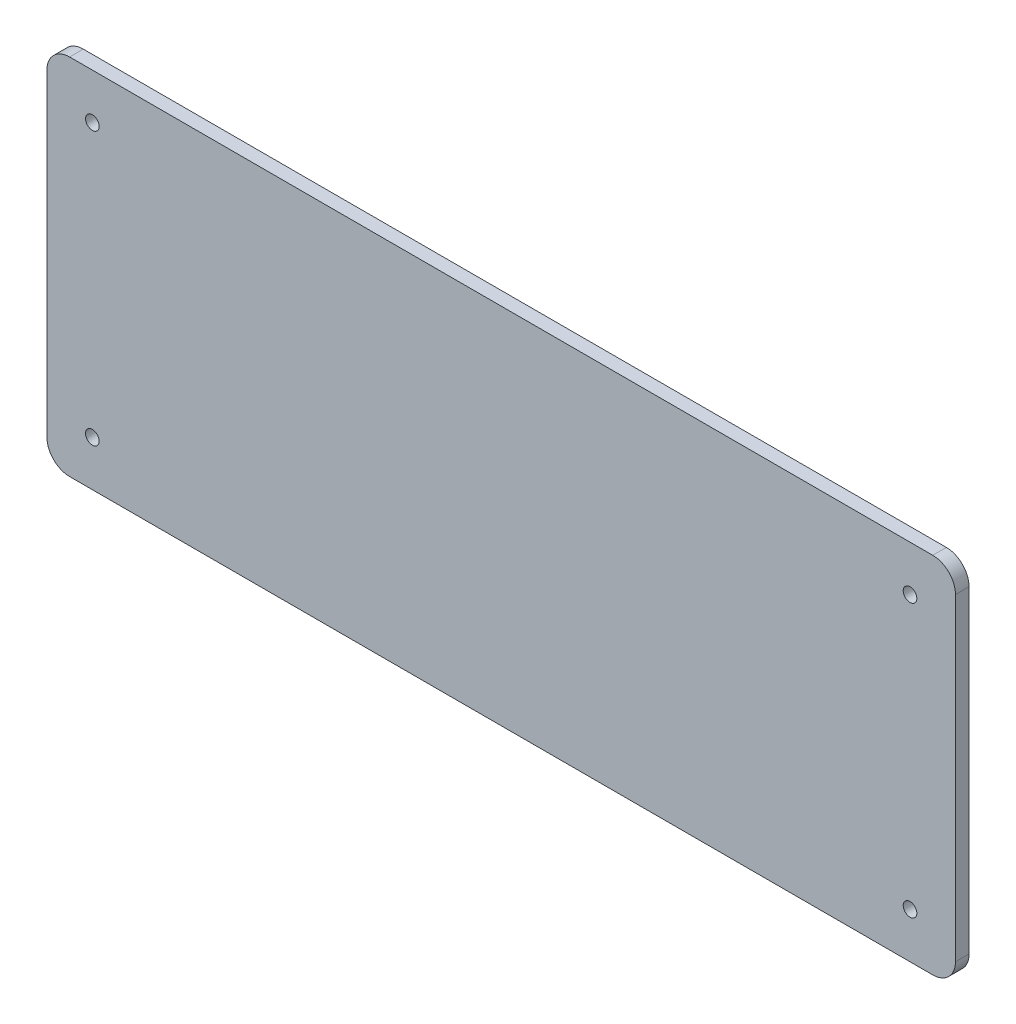
ISO-10303-21;
HEADER;
FILE_DESCRIPTION(('STEP AP214'),'2;1');
FILE_NAME('part.step','',(''),(''),'','','');
FILE_SCHEMA(('AUTOMOTIVE_DESIGN { 1 0 10303 214 1 1 1 1 }'));
ENDSEC;
DATA;
#1=APPLICATION_CONTEXT('core data for automotive mechanical design processes');
#2=APPLICATION_PROTOCOL_DEFINITION('international standard','automotive_design',2000,#1);
#3=PRODUCT_CONTEXT('',#1,'mechanical');
#4=PRODUCT('Part','Part','',(#3));
#5=PRODUCT_RELATED_PRODUCT_CATEGORY('part','',(#4));
#6=PRODUCT_DEFINITION_FORMATION('','',#4);
#7=PRODUCT_DEFINITION_CONTEXT('part definition',#1,'design');
#8=PRODUCT_DEFINITION('design','',#6,#7);
#9=PRODUCT_DEFINITION_SHAPE('','',#8);
#10=(LENGTH_UNIT() NAMED_UNIT(*) SI_UNIT(.MILLI.,.METRE.));
#11=(NAMED_UNIT(*) PLANE_ANGLE_UNIT() SI_UNIT($,.RADIAN.));
#12=(NAMED_UNIT(*) SI_UNIT($,.STERADIAN.) SOLID_ANGLE_UNIT());
#13=UNCERTAINTY_MEASURE_WITH_UNIT(LENGTH_MEASURE(1.E-05),#10,'distance_accuracy_value','');
#14=(GEOMETRIC_REPRESENTATION_CONTEXT(3) GLOBAL_UNCERTAINTY_ASSIGNED_CONTEXT((#13)) GLOBAL_UNIT_ASSIGNED_CONTEXT((#10,
#11,#12)) REPRESENTATION_CONTEXT('',''));
#15=CARTESIAN_POINT('',(0.,0.,0.));
#16=DIRECTION('',(0.,0.,1.));
#17=DIRECTION('',(1.,0.,0.));
#18=AXIS2_PLACEMENT_3D('',#15,#16,#17);
#19=CARTESIAN_POINT('',(95.,35.,3.));
#20=DIRECTION('',(0.,0.,1.));
#21=DIRECTION('',(1.,0.,0.));
#22=AXIS2_PLACEMENT_3D('',#19,#20,#21);
#23=PLANE('',#22);
#24=CARTESIAN_POINT('',(90.0000000000006,-30.,3.));
#25=DIRECTION('',(0.,0.,1.));
#26=DIRECTION('',(1.,0.,0.));
#27=AXIS2_PLACEMENT_3D('',#24,#25,#26);
#28=CIRCLE('',#27,1.5);
#29=CARTESIAN_POINT('',(91.5000000000006,-30.,3.));
#30=VERTEX_POINT('',#29);
#31=EDGE_CURVE('E191',#30,#30,#28,.T.);
#32=ORIENTED_EDGE('',*,*,#31,.F.);
#33=EDGE_LOOP('',(#32));
#34=FACE_BOUND('',#33,.T.);
#35=CARTESIAN_POINT('',(-90.,30.,3.));
#36=DIRECTION('',(0.,0.,1.));
#37=DIRECTION('',(1.,0.,0.));
#38=AXIS2_PLACEMENT_3D('',#35,#36,#37);
#39=CIRCLE('',#38,1.5);
#40=CARTESIAN_POINT('',(-88.5,30.,3.));
#41=VERTEX_POINT('',#40);
#42=EDGE_CURVE('E137',#41,#41,#39,.T.);
#43=ORIENTED_EDGE('',*,*,#42,.F.);
#44=EDGE_LOOP('',(#43));
#45=FACE_BOUND('',#44,.T.);
#46=CARTESIAN_POINT('',(95.,35.,3.));
#47=DIRECTION('',(0.,0.,1.));
#48=DIRECTION('',(1.,0.,0.));
#49=AXIS2_PLACEMENT_3D('',#46,#47,#48);
#50=CIRCLE('',#49,5.);
#51=CARTESIAN_POINT('',(100.,35.,3.));
#52=VERTEX_POINT('',#51);
#53=CARTESIAN_POINT('',(95.,40.,3.));
#54=VERTEX_POINT('',#53);
#55=EDGE_CURVE('E148',#52,#54,#50,.T.);
#56=ORIENTED_EDGE('',*,*,#55,.T.);
#57=DIRECTION('',(-1.,0.,0.));
#58=VECTOR('',#57,1.);
#59=CARTESIAN_POINT('',(95.,40.,3.));
#60=LINE('',#59,#58);
#61=CARTESIAN_POINT('',(-95.,40.,3.));
#62=VERTEX_POINT('',#61);
#63=EDGE_CURVE('E96',#54,#62,#60,.T.);
#64=ORIENTED_EDGE('',*,*,#63,.T.);
#65=CARTESIAN_POINT('',(-95.,35.,3.));
#66=DIRECTION('',(0.,0.,1.));
#67=DIRECTION('',(1.,0.,0.));
#68=AXIS2_PLACEMENT_3D('',#65,#66,#67);
#69=CIRCLE('',#68,5.);
#70=CARTESIAN_POINT('',(-100.,35.,3.));
#71=VERTEX_POINT('',#70);
#72=EDGE_CURVE('E163',#62,#71,#69,.T.);
#73=ORIENTED_EDGE('',*,*,#72,.T.);
#74=DIRECTION('',(0.,-1.,0.));
#75=VECTOR('',#74,1.);
#76=CARTESIAN_POINT('',(-100.,-35.,3.));
#77=LINE('',#76,#75);
#78=CARTESIAN_POINT('',(-100.,-35.,3.));
#79=VERTEX_POINT('',#78);
#80=EDGE_CURVE('E176',#71,#79,#77,.T.);
#81=ORIENTED_EDGE('',*,*,#80,.T.);
#82=CARTESIAN_POINT('',(-95.,-35.,3.));
#83=DIRECTION('',(0.,0.,1.));
#84=DIRECTION('',(-1.,0.,0.));
#85=AXIS2_PLACEMENT_3D('',#82,#83,#84);
#86=CIRCLE('',#85,5.);
#87=CARTESIAN_POINT('',(-95.,-40.,3.));
#88=VERTEX_POINT('',#87);
#89=EDGE_CURVE('E115',#79,#88,#86,.T.);
#90=ORIENTED_EDGE('',*,*,#89,.T.);
#91=DIRECTION('',(1.,0.,0.));
#92=VECTOR('',#91,1.);
#93=CARTESIAN_POINT('',(95.,-40.,3.));
#94=LINE('',#93,#92);
#95=CARTESIAN_POINT('',(95.,-40.,3.));
#96=VERTEX_POINT('',#95);
#97=EDGE_CURVE('E109',#88,#96,#94,.T.);
#98=ORIENTED_EDGE('',*,*,#97,.T.);
#99=CARTESIAN_POINT('',(95.,-35.,3.));
#100=DIRECTION('',(0.,0.,1.));
#101=DIRECTION('',(1.,0.,0.));
#102=AXIS2_PLACEMENT_3D('',#99,#100,#101);
#103=CIRCLE('',#102,5.);
#104=CARTESIAN_POINT('',(100.,-35.,3.));
#105=VERTEX_POINT('',#104);
#106=EDGE_CURVE('E113',#96,#105,#103,.T.);
#107=ORIENTED_EDGE('',*,*,#106,.T.);
#108=DIRECTION('',(0.,1.,0.));
#109=VECTOR('',#108,1.);
#110=CARTESIAN_POINT('',(100.,-35.,3.));
#111=LINE('',#110,#109);
#112=EDGE_CURVE('E53',#105,#52,#111,.T.);
#113=ORIENTED_EDGE('',*,*,#112,.T.);
#114=EDGE_LOOP('',(#56,#64,#73,#81,#90,#98,#107,#113));
#115=FACE_BOUND('',#114,.T.);
#116=CARTESIAN_POINT('',(90.,30.,3.));
#117=DIRECTION('',(0.,0.,1.));
#118=DIRECTION('',(1.,0.,0.));
#119=AXIS2_PLACEMENT_3D('',#116,#117,#118);
#120=CIRCLE('',#119,1.5);
#121=CARTESIAN_POINT('',(91.5,30.,3.));
#122=VERTEX_POINT('',#121);
#123=EDGE_CURVE('E185',#122,#122,#120,.T.);
#124=ORIENTED_EDGE('',*,*,#123,.F.);
#125=EDGE_LOOP('',(#124));
#126=FACE_BOUND('',#125,.T.);
#127=CARTESIAN_POINT('',(-89.9999999999994,-30.,3.));
#128=DIRECTION('',(0.,0.,1.));
#129=DIRECTION('',(1.,0.,0.));
#130=AXIS2_PLACEMENT_3D('',#127,#128,#129);
#131=CIRCLE('',#130,1.5);
#132=CARTESIAN_POINT('',(-88.4999999999994,-30.,3.));
#133=VERTEX_POINT('',#132);
#134=EDGE_CURVE('E197',#133,#133,#131,.T.);
#135=ORIENTED_EDGE('',*,*,#134,.F.);
#136=EDGE_LOOP('',(#135));
#137=FACE_BOUND('',#136,.T.);
#138=ADVANCED_FACE('F36',(#34,#45,#115,#126,#137),#23,.T.);
#139=CARTESIAN_POINT('',(95.,35.,0.));
#140=DIRECTION('',(0.,0.,1.));
#141=DIRECTION('',(1.,0.,0.));
#142=AXIS2_PLACEMENT_3D('',#139,#140,#141);
#143=PLANE('',#142);
#144=CARTESIAN_POINT('',(95.,35.,0.));
#145=DIRECTION('',(0.,0.,1.));
#146=DIRECTION('',(1.,0.,0.));
#147=AXIS2_PLACEMENT_3D('',#144,#145,#146);
#148=CIRCLE('',#147,5.);
#149=CARTESIAN_POINT('',(100.,35.,0.));
#150=VERTEX_POINT('',#149);
#151=CARTESIAN_POINT('',(95.,40.,0.));
#152=VERTEX_POINT('',#151);
#153=EDGE_CURVE('E133',#150,#152,#148,.T.);
#154=ORIENTED_EDGE('',*,*,#153,.F.);
#155=DIRECTION('',(0.,1.,0.));
#156=VECTOR('',#155,1.);
#157=CARTESIAN_POINT('',(100.,-35.,0.));
#158=LINE('',#157,#156);
#159=CARTESIAN_POINT('',(100.,-35.,0.));
#160=VERTEX_POINT('',#159);
#161=EDGE_CURVE('E88',#160,#150,#158,.T.);
#162=ORIENTED_EDGE('',*,*,#161,.F.);
#163=CARTESIAN_POINT('',(95.,-35.,0.));
#164=DIRECTION('',(0.,0.,1.));
#165=DIRECTION('',(1.,0.,0.));
#166=AXIS2_PLACEMENT_3D('',#163,#164,#165);
#167=CIRCLE('',#166,5.);
#168=CARTESIAN_POINT('',(95.,-40.,0.));
#169=VERTEX_POINT('',#168);
#170=EDGE_CURVE('E82',#169,#160,#167,.T.);
#171=ORIENTED_EDGE('',*,*,#170,.F.);
#172=DIRECTION('',(1.,0.,0.));
#173=VECTOR('',#172,1.);
#174=CARTESIAN_POINT('',(95.,-40.,0.));
#175=LINE('',#174,#173);
#176=CARTESIAN_POINT('',(-95.,-40.,0.));
#177=VERTEX_POINT('',#176);
#178=EDGE_CURVE('E123',#177,#169,#175,.T.);
#179=ORIENTED_EDGE('',*,*,#178,.F.);
#180=CARTESIAN_POINT('',(-95.,-35.,0.));
#181=DIRECTION('',(0.,0.,1.));
#182=DIRECTION('',(-1.,0.,0.));
#183=AXIS2_PLACEMENT_3D('',#180,#181,#182);
#184=CIRCLE('',#183,5.);
#185=CARTESIAN_POINT('',(-100.,-35.,0.));
#186=VERTEX_POINT('',#185);
#187=EDGE_CURVE('E143',#186,#177,#184,.T.);
#188=ORIENTED_EDGE('',*,*,#187,.F.);
#189=DIRECTION('',(0.,-1.,0.));
#190=VECTOR('',#189,1.);
#191=CARTESIAN_POINT('',(-100.,-35.,0.));
#192=LINE('',#191,#190);
#193=CARTESIAN_POINT('',(-100.,35.,0.));
#194=VERTEX_POINT('',#193);
#195=EDGE_CURVE('E141',#194,#186,#192,.T.);
#196=ORIENTED_EDGE('',*,*,#195,.F.);
#197=CARTESIAN_POINT('',(-95.,35.,0.));
#198=DIRECTION('',(0.,0.,1.));
#199=DIRECTION('',(1.,0.,0.));
#200=AXIS2_PLACEMENT_3D('',#197,#198,#199);
#201=CIRCLE('',#200,5.);
#202=CARTESIAN_POINT('',(-95.,40.,0.));
#203=VERTEX_POINT('',#202);
#204=EDGE_CURVE('E139',#203,#194,#201,.T.);
#205=ORIENTED_EDGE('',*,*,#204,.F.);
#206=DIRECTION('',(-1.,0.,0.));
#207=VECTOR('',#206,1.);
#208=CARTESIAN_POINT('',(95.,40.,0.));
#209=LINE('',#208,#207);
#210=EDGE_CURVE('E136',#152,#203,#209,.T.);
#211=ORIENTED_EDGE('',*,*,#210,.F.);
#212=EDGE_LOOP('',(#154,#162,#171,#179,#188,#196,#205,#211));
#213=FACE_BOUND('',#212,.T.);
#214=CARTESIAN_POINT('',(-90.,30.,0.));
#215=DIRECTION('',(0.,0.,1.));
#216=DIRECTION('',(1.,0.,0.));
#217=AXIS2_PLACEMENT_3D('',#214,#215,#216);
#218=CIRCLE('',#217,1.5);
#219=CARTESIAN_POINT('',(-88.5,30.,0.));
#220=VERTEX_POINT('',#219);
#221=EDGE_CURVE('E182',#220,#220,#218,.T.);
#222=ORIENTED_EDGE('',*,*,#221,.T.);
#223=EDGE_LOOP('',(#222));
#224=FACE_BOUND('',#223,.T.);
#225=CARTESIAN_POINT('',(90.,30.,0.));
#226=DIRECTION('',(0.,0.,1.));
#227=DIRECTION('',(1.,0.,0.));
#228=AXIS2_PLACEMENT_3D('',#225,#226,#227);
#229=CIRCLE('',#228,1.5);
#230=CARTESIAN_POINT('',(91.5,30.,0.));
#231=VERTEX_POINT('',#230);
#232=EDGE_CURVE('E188',#231,#231,#229,.T.);
#233=ORIENTED_EDGE('',*,*,#232,.T.);
#234=EDGE_LOOP('',(#233));
#235=FACE_BOUND('',#234,.T.);
#236=CARTESIAN_POINT('',(90.0000000000006,-30.,0.));
#237=DIRECTION('',(0.,0.,1.));
#238=DIRECTION('',(1.,0.,0.));
#239=AXIS2_PLACEMENT_3D('',#236,#237,#238);
#240=CIRCLE('',#239,1.5);
#241=CARTESIAN_POINT('',(91.5000000000006,-30.,0.));
#242=VERTEX_POINT('',#241);
#243=EDGE_CURVE('E194',#242,#242,#240,.T.);
#244=ORIENTED_EDGE('',*,*,#243,.T.);
#245=EDGE_LOOP('',(#244));
#246=FACE_BOUND('',#245,.T.);
#247=CARTESIAN_POINT('',(-89.9999999999994,-30.,0.));
#248=DIRECTION('',(0.,0.,1.));
#249=DIRECTION('',(1.,0.,0.));
#250=AXIS2_PLACEMENT_3D('',#247,#248,#249);
#251=CIRCLE('',#250,1.5);
#252=CARTESIAN_POINT('',(-88.4999999999994,-30.,0.));
#253=VERTEX_POINT('',#252);
#254=EDGE_CURVE('E200',#253,#253,#251,.T.);
#255=ORIENTED_EDGE('',*,*,#254,.T.);
#256=EDGE_LOOP('',(#255));
#257=FACE_BOUND('',#256,.T.);
#258=ADVANCED_FACE('F167',(#213,#224,#235,#246,#257),#143,.F.);
#259=CARTESIAN_POINT('',(95.,35.,3.));
#260=DIRECTION('',(0.,0.,-1.));
#261=DIRECTION('',(-1.,0.,0.));
#262=AXIS2_PLACEMENT_3D('',#259,#260,#261);
#263=CYLINDRICAL_SURFACE('',#262,5.);
#264=ORIENTED_EDGE('',*,*,#153,.T.);
#265=DIRECTION('',(0.,0.,-1.));
#266=VECTOR('',#265,1.);
#267=CARTESIAN_POINT('',(95.,40.,3.));
#268=LINE('',#267,#266);
#269=EDGE_CURVE('E11',#54,#152,#268,.T.);
#270=ORIENTED_EDGE('',*,*,#269,.F.);
#271=ORIENTED_EDGE('',*,*,#55,.F.);
#272=DIRECTION('',(0.,0.,-1.));
#273=VECTOR('',#272,1.);
#274=CARTESIAN_POINT('',(100.,35.,3.));
#275=LINE('',#274,#273);
#276=EDGE_CURVE('E129',#52,#150,#275,.T.);
#277=ORIENTED_EDGE('',*,*,#276,.T.);
#278=EDGE_LOOP('',(#264,#270,#271,#277));
#279=FACE_BOUND('',#278,.T.);
#280=ADVANCED_FACE('F38',(#279),#263,.T.);
#281=CARTESIAN_POINT('',(95.,40.,3.));
#282=DIRECTION('',(0.,-1.,0.));
#283=DIRECTION('',(1.,0.,0.));
#284=AXIS2_PLACEMENT_3D('',#281,#282,#283);
#285=PLANE('',#284);
#286=ORIENTED_EDGE('',*,*,#210,.T.);
#287=DIRECTION('',(0.,0.,-1.));
#288=VECTOR('',#287,1.);
#289=CARTESIAN_POINT('',(-95.,40.,3.));
#290=LINE('',#289,#288);
#291=EDGE_CURVE('E45',#62,#203,#290,.T.);
#292=ORIENTED_EDGE('',*,*,#291,.F.);
#293=ORIENTED_EDGE('',*,*,#63,.F.);
#294=ORIENTED_EDGE('',*,*,#269,.T.);
#295=EDGE_LOOP('',(#286,#292,#293,#294));
#296=FACE_BOUND('',#295,.T.);
#297=ADVANCED_FACE('F234',(#296),#285,.F.);
#298=CARTESIAN_POINT('',(-95.,35.,3.));
#299=DIRECTION('',(0.,0.,-1.));
#300=DIRECTION('',(-1.,0.,0.));
#301=AXIS2_PLACEMENT_3D('',#298,#299,#300);
#302=CYLINDRICAL_SURFACE('',#301,5.);
#303=ORIENTED_EDGE('',*,*,#204,.T.);
#304=DIRECTION('',(0.,0.,-1.));
#305=VECTOR('',#304,1.);
#306=CARTESIAN_POINT('',(-100.,35.,3.));
#307=LINE('',#306,#305);
#308=EDGE_CURVE('E155',#71,#194,#307,.T.);
#309=ORIENTED_EDGE('',*,*,#308,.F.);
#310=ORIENTED_EDGE('',*,*,#72,.F.);
#311=ORIENTED_EDGE('',*,*,#291,.T.);
#312=EDGE_LOOP('',(#303,#309,#310,#311));
#313=FACE_BOUND('',#312,.T.);
#314=ADVANCED_FACE('F161',(#313),#302,.T.);
#315=CARTESIAN_POINT('',(-100.,-35.,3.));
#316=DIRECTION('',(1.,0.,0.));
#317=DIRECTION('',(0.,0.,-1.));
#318=AXIS2_PLACEMENT_3D('',#315,#316,#317);
#319=PLANE('',#318);
#320=ORIENTED_EDGE('',*,*,#195,.T.);
#321=DIRECTION('',(0.,0.,-1.));
#322=VECTOR('',#321,1.);
#323=CARTESIAN_POINT('',(-100.,-35.,3.));
#324=LINE('',#323,#322);
#325=EDGE_CURVE('E152',#79,#186,#324,.T.);
#326=ORIENTED_EDGE('',*,*,#325,.F.);
#327=ORIENTED_EDGE('',*,*,#80,.F.);
#328=ORIENTED_EDGE('',*,*,#308,.T.);
#329=EDGE_LOOP('',(#320,#326,#327,#328));
#330=FACE_BOUND('',#329,.T.);
#331=ADVANCED_FACE('F172',(#330),#319,.F.);
#332=CARTESIAN_POINT('',(-95.,-35.,3.));
#333=DIRECTION('',(0.,0.,-1.));
#334=DIRECTION('',(-1.,0.,0.));
#335=AXIS2_PLACEMENT_3D('',#332,#333,#334);
#336=CYLINDRICAL_SURFACE('',#335,5.);
#337=ORIENTED_EDGE('',*,*,#187,.T.);
#338=DIRECTION('',(0.,0.,-1.));
#339=VECTOR('',#338,1.);
#340=CARTESIAN_POINT('',(-95.,-40.,3.));
#341=LINE('',#340,#339);
#342=EDGE_CURVE('E124',#88,#177,#341,.T.);
#343=ORIENTED_EDGE('',*,*,#342,.F.);
#344=ORIENTED_EDGE('',*,*,#89,.F.);
#345=ORIENTED_EDGE('',*,*,#325,.T.);
#346=EDGE_LOOP('',(#337,#343,#344,#345));
#347=FACE_BOUND('',#346,.T.);
#348=ADVANCED_FACE('F175',(#347),#336,.T.);
#349=CARTESIAN_POINT('',(95.,-40.,3.));
#350=DIRECTION('',(0.,1.,0.));
#351=DIRECTION('',(-1.,0.,0.));
#352=AXIS2_PLACEMENT_3D('',#349,#350,#351);
#353=PLANE('',#352);
#354=ORIENTED_EDGE('',*,*,#178,.T.);
#355=DIRECTION('',(0.,0.,-1.));
#356=VECTOR('',#355,1.);
#357=CARTESIAN_POINT('',(95.,-40.,3.));
#358=LINE('',#357,#356);
#359=EDGE_CURVE('E120',#96,#169,#358,.T.);
#360=ORIENTED_EDGE('',*,*,#359,.F.);
#361=ORIENTED_EDGE('',*,*,#97,.F.);
#362=ORIENTED_EDGE('',*,*,#342,.T.);
#363=EDGE_LOOP('',(#354,#360,#361,#362));
#364=FACE_BOUND('',#363,.T.);
#365=ADVANCED_FACE('F121',(#364),#353,.F.);
#366=CARTESIAN_POINT('',(95.,-35.,3.));
#367=DIRECTION('',(0.,0.,-1.));
#368=DIRECTION('',(-1.,0.,0.));
#369=AXIS2_PLACEMENT_3D('',#366,#367,#368);
#370=CYLINDRICAL_SURFACE('',#369,5.);
#371=ORIENTED_EDGE('',*,*,#170,.T.);
#372=DIRECTION('',(0.,0.,-1.));
#373=VECTOR('',#372,1.);
#374=CARTESIAN_POINT('',(100.,-35.,3.));
#375=LINE('',#374,#373);
#376=EDGE_CURVE('E125',#105,#160,#375,.T.);
#377=ORIENTED_EDGE('',*,*,#376,.F.);
#378=ORIENTED_EDGE('',*,*,#106,.F.);
#379=ORIENTED_EDGE('',*,*,#359,.T.);
#380=EDGE_LOOP('',(#371,#377,#378,#379));
#381=FACE_BOUND('',#380,.T.);
#382=ADVANCED_FACE('F127',(#381),#370,.T.);
#383=CARTESIAN_POINT('',(100.,-35.,3.));
#384=DIRECTION('',(-1.,0.,0.));
#385=DIRECTION('',(0.,0.,1.));
#386=AXIS2_PLACEMENT_3D('',#383,#384,#385);
#387=PLANE('',#386);
#388=ORIENTED_EDGE('',*,*,#161,.T.);
#389=ORIENTED_EDGE('',*,*,#276,.F.);
#390=ORIENTED_EDGE('',*,*,#112,.F.);
#391=ORIENTED_EDGE('',*,*,#376,.T.);
#392=EDGE_LOOP('',(#388,#389,#390,#391));
#393=FACE_BOUND('',#392,.T.);
#394=ADVANCED_FACE('F222',(#393),#387,.F.);
#395=CARTESIAN_POINT('',(-90.,30.,3.));
#396=DIRECTION('',(0.,0.,-1.));
#397=DIRECTION('',(-1.,0.,0.));
#398=AXIS2_PLACEMENT_3D('',#395,#396,#397);
#399=CYLINDRICAL_SURFACE('',#398,1.5);
#400=ORIENTED_EDGE('',*,*,#42,.T.);
#401=EDGE_LOOP('',(#400));
#402=FACE_BOUND('',#401,.T.);
#403=ORIENTED_EDGE('',*,*,#221,.F.);
#404=EDGE_LOOP('',(#403));
#405=FACE_BOUND('',#404,.T.);
#406=ADVANCED_FACE('F219',(#402,#405),#399,.F.);
#407=CARTESIAN_POINT('',(90.,30.,3.));
#408=DIRECTION('',(0.,0.,-1.));
#409=DIRECTION('',(-1.,0.,0.));
#410=AXIS2_PLACEMENT_3D('',#407,#408,#409);
#411=CYLINDRICAL_SURFACE('',#410,1.5);
#412=ORIENTED_EDGE('',*,*,#123,.T.);
#413=EDGE_LOOP('',(#412));
#414=FACE_BOUND('',#413,.T.);
#415=ORIENTED_EDGE('',*,*,#232,.F.);
#416=EDGE_LOOP('',(#415));
#417=FACE_BOUND('',#416,.T.);
#418=ADVANCED_FACE('F298',(#414,#417),#411,.F.);
#419=CARTESIAN_POINT('',(90.0000000000006,-30.,3.));
#420=DIRECTION('',(0.,0.,-1.));
#421=DIRECTION('',(-1.,0.,0.));
#422=AXIS2_PLACEMENT_3D('',#419,#420,#421);
#423=CYLINDRICAL_SURFACE('',#422,1.5);
#424=ORIENTED_EDGE('',*,*,#31,.T.);
#425=EDGE_LOOP('',(#424));
#426=FACE_BOUND('',#425,.T.);
#427=ORIENTED_EDGE('',*,*,#243,.F.);
#428=EDGE_LOOP('',(#427));
#429=FACE_BOUND('',#428,.T.);
#430=ADVANCED_FACE('F306',(#426,#429),#423,.F.);
#431=CARTESIAN_POINT('',(-89.9999999999994,-30.,3.));
#432=DIRECTION('',(0.,0.,-1.));
#433=DIRECTION('',(-1.,0.,0.));
#434=AXIS2_PLACEMENT_3D('',#431,#432,#433);
#435=CYLINDRICAL_SURFACE('',#434,1.5);
#436=ORIENTED_EDGE('',*,*,#134,.T.);
#437=EDGE_LOOP('',(#436));
#438=FACE_BOUND('',#437,.T.);
#439=ORIENTED_EDGE('',*,*,#254,.F.);
#440=EDGE_LOOP('',(#439));
#441=FACE_BOUND('',#440,.T.);
#442=ADVANCED_FACE('F206',(#438,#441),#435,.F.);
#443=CLOSED_SHELL('',(#138,#258,#280,#297,#314,#331,#348,#365,#382,#394,#406,#418,#430,#442));
#444=MANIFOLD_SOLID_BREP('B2',#443);
#445=ADVANCED_BREP_SHAPE_REPRESENTATION('',(#18,#444),#14);
#446=SHAPE_DEFINITION_REPRESENTATION(#9,#445);
ENDSEC;
END-ISO-10303-21;
